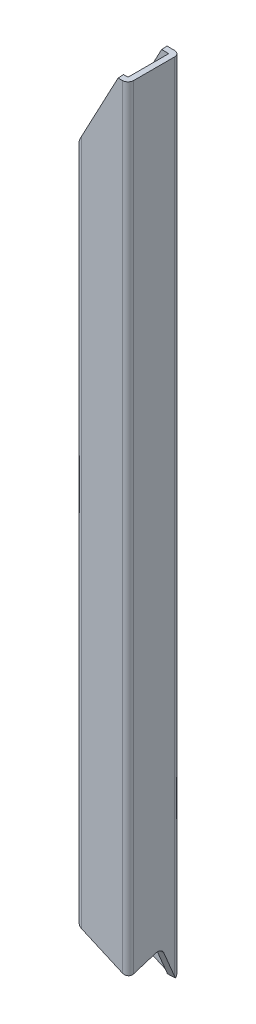
ISO-10303-21;
HEADER;
FILE_DESCRIPTION(('STEP AP214'),'2;1');
FILE_NAME('part.step','',(''),(''),'','','');
FILE_SCHEMA(('AUTOMOTIVE_DESIGN { 1 0 10303 214 1 1 1 1 }'));
ENDSEC;
DATA;
#1=APPLICATION_CONTEXT('core data for automotive mechanical design processes');
#2=APPLICATION_PROTOCOL_DEFINITION('international standard','automotive_design',2000,#1);
#3=PRODUCT_CONTEXT('',#1,'mechanical');
#4=PRODUCT('Part','Part','',(#3));
#5=PRODUCT_RELATED_PRODUCT_CATEGORY('part','',(#4));
#6=PRODUCT_DEFINITION_FORMATION('','',#4);
#7=PRODUCT_DEFINITION_CONTEXT('part definition',#1,'design');
#8=PRODUCT_DEFINITION('design','',#6,#7);
#9=PRODUCT_DEFINITION_SHAPE('','',#8);
#10=(LENGTH_UNIT() NAMED_UNIT(*) SI_UNIT(.MILLI.,.METRE.));
#11=(NAMED_UNIT(*) PLANE_ANGLE_UNIT() SI_UNIT($,.RADIAN.));
#12=(NAMED_UNIT(*) SI_UNIT($,.STERADIAN.) SOLID_ANGLE_UNIT());
#13=UNCERTAINTY_MEASURE_WITH_UNIT(LENGTH_MEASURE(1.E-05),#10,'distance_accuracy_value','');
#14=(GEOMETRIC_REPRESENTATION_CONTEXT(3) GLOBAL_UNCERTAINTY_ASSIGNED_CONTEXT((#13)) GLOBAL_UNIT_ASSIGNED_CONTEXT((#10,
#11,#12)) REPRESENTATION_CONTEXT('',''));
#15=CARTESIAN_POINT('',(0.,0.,0.));
#16=DIRECTION('',(0.,0.,1.));
#17=DIRECTION('',(1.,0.,0.));
#18=AXIS2_PLACEMENT_3D('',#15,#16,#17);
#19=CARTESIAN_POINT('',(0.,395.,2.80000000000002));
#20=DIRECTION('',(1.,0.,0.));
#21=DIRECTION('',(0.,0.,-1.));
#22=AXIS2_PLACEMENT_3D('',#19,#20,#21);
#23=PLANE('',#22);
#24=DIRECTION('',(0.,-1.,0.));
#25=VECTOR('',#24,1.);
#26=CARTESIAN_POINT('',(0.,395.,2.80000000000002));
#27=LINE('',#26,#25);
#28=CARTESIAN_POINT('',(0.,358.74045546164,2.80000000000002));
#29=VERTEX_POINT('',#28);
#30=CARTESIAN_POINT('',(0.,14.5870261023159,2.80000000000002));
#31=VERTEX_POINT('',#30);
#32=EDGE_CURVE('E213',#29,#31,#27,.T.);
#33=ORIENTED_EDGE('',*,*,#32,.T.);
#34=DIRECTION('',(0.,-0.298228213360965,0.954494595456426));
#35=VECTOR('',#34,1.);
#36=CARTESIAN_POINT('',(0.,48.4209815814461,-105.487298789719));
#37=LINE('',#36,#35);
#38=CARTESIAN_POINT('',(0.,11.7204381577487,11.974660806415));
#39=VERTEX_POINT('',#38);
#40=EDGE_CURVE('E211',#31,#39,#37,.T.);
#41=ORIENTED_EDGE('',*,*,#40,.T.);
#42=DIRECTION('',(0.,-0.922539490648256,-0.385902692649918));
#43=VECTOR('',#42,1.);
#44=CARTESIAN_POINT('',(0.,334.65539188562,147.059900471106));
#45=LINE('',#44,#43);
#46=CARTESIAN_POINT('',(0.,25.189594700071,17.6088735746435));
#47=VERTEX_POINT('',#46);
#48=EDGE_CURVE('E279',#47,#39,#45,.T.);
#49=ORIENTED_EDGE('',*,*,#48,.F.);
#50=CARTESIAN_POINT('',(0.,24.3305192274788,20.3583884057098));
#51=DIRECTION('',(1.,0.,0.));
#52=DIRECTION('',(0.,0.652023586451747,0.758198682873164));
#53=AXIS2_PLACEMENT_3D('',#50,#51,#52);
#54=ELLIPSE('',#53,3.12461688954562,2.8);
#55=CARTESIAN_POINT('',(0.,27.1447014447458,21.5355743216079));
#56=VERTEX_POINT('',#55);
#57=EDGE_CURVE('E219',#56,#47,#54,.F.);
#58=ORIENTED_EDGE('',*,*,#57,.F.);
#59=DIRECTION('',(0.,0.298228213360962,-0.954494595456427));
#60=VECTOR('',#59,1.);
#61=CARTESIAN_POINT('',(0.,65.1949928959895,-100.246322623854));
#62=LINE('',#61,#60);
#63=CARTESIAN_POINT('',(0.,26.7496364409316,22.8));
#64=VERTEX_POINT('',#63);
#65=EDGE_CURVE('E293',#64,#56,#62,.T.);
#66=ORIENTED_EDGE('',*,*,#65,.F.);
#67=DIRECTION('',(0.,-1.,0.));
#68=VECTOR('',#67,1.);
#69=CARTESIAN_POINT('',(0.,395.,22.8));
#70=LINE('',#69,#68);
#71=CARTESIAN_POINT('',(0.,356.354468869818,22.8));
#72=VERTEX_POINT('',#71);
#73=EDGE_CURVE('E236',#72,#64,#70,.T.);
#74=ORIENTED_EDGE('',*,*,#73,.F.);
#75=DIRECTION('',(0.,-0.118459331661431,0.992958904860784));
#76=VECTOR('',#75,1.);
#77=CARTESIAN_POINT('',(0.,359.249271627046,-1.46503792728784));
#78=LINE('',#77,#76);
#79=EDGE_CURVE('E280',#29,#72,#78,.T.);
#80=ORIENTED_EDGE('',*,*,#79,.F.);
#81=EDGE_LOOP('',(#33,#41,#49,#58,#66,#74,#80));
#82=FACE_BOUND('',#81,.T.);
#83=ADVANCED_FACE('F35',(#82),#23,.F.);
#84=CARTESIAN_POINT('',(2.8,395.,22.8));
#85=DIRECTION('',(0.,-1.,0.));
#86=DIRECTION('',(0.,0.,-1.));
#87=AXIS2_PLACEMENT_3D('',#84,#85,#86);
#88=CYLINDRICAL_SURFACE('',#87,2.8);
#89=CARTESIAN_POINT('',(2.8,25.5168770642586,22.8));
#90=DIRECTION('',(-0.387417802967793,-0.879952624037117,-0.274937857331073));
#91=DIRECTION('',(0.71761098211459,-0.475061448078238,0.509265253967263));
#92=AXIS2_PLACEMENT_3D('',#89,#90,#91);
#93=ELLIPSE('',#92,3.18198948842716,2.8);
#94=CARTESIAN_POINT('',(2.80000000000002,24.6420276922604,25.6));
#95=VERTEX_POINT('',#94);
#96=EDGE_CURVE('E297',#95,#64,#93,.T.);
#97=ORIENTED_EDGE('',*,*,#96,.F.);
#98=DIRECTION('',(0.,-1.,0.));
#99=VECTOR('',#98,1.);
#100=CARTESIAN_POINT('',(2.80000000000002,395.,25.6));
#101=LINE('',#100,#99);
#102=CARTESIAN_POINT('',(2.80000000000002,361.282665806789,25.6));
#103=VERTEX_POINT('',#102);
#104=EDGE_CURVE('E270',#103,#95,#101,.T.);
#105=ORIENTED_EDGE('',*,*,#104,.F.);
#106=CARTESIAN_POINT('',(2.8,361.616703929644,22.8));
#107=DIRECTION('',(-0.881424160088028,0.468999886965857,0.055951372093341));
#108=DIRECTION('',(-0.468057814635929,-0.883198225782872,0.0297115488021969));
#109=AXIS2_PLACEMENT_3D('',#106,#107,#108);
#110=ELLIPSE('',#109,5.97015069260313,2.8);
#111=EDGE_CURVE('E276',#72,#103,#110,.T.);
#112=ORIENTED_EDGE('',*,*,#111,.F.);
#113=ORIENTED_EDGE('',*,*,#73,.T.);
#114=EDGE_LOOP('',(#97,#105,#112,#113));
#115=FACE_BOUND('',#114,.T.);
#116=ADVANCED_FACE('F391',(#115),#88,.T.);
#117=CARTESIAN_POINT('',(2.80000000000002,395.,25.6));
#118=DIRECTION('',(0.,0.,-1.));
#119=DIRECTION('',(-1.,0.,0.));
#120=AXIS2_PLACEMENT_3D('',#117,#118,#119);
#121=PLANE('',#120);
#122=DIRECTION('',(-0.915223508976725,0.402946558015242,0.));
#123=VECTOR('',#122,1.);
#124=CARTESIAN_POINT('',(-133.782895453762,84.7755437864679,25.6));
#125=LINE('',#124,#123);
#126=CARTESIAN_POINT('',(22.8,15.8366035731672,25.6));
#127=VERTEX_POINT('',#126);
#128=EDGE_CURVE('E300',#127,#95,#125,.T.);
#129=ORIENTED_EDGE('',*,*,#128,.F.);
#130=DIRECTION('',(0.,-1.,0.));
#131=VECTOR('',#130,1.);
#132=CARTESIAN_POINT('',(22.8,395.,25.6));
#133=LINE('',#132,#131);
#134=CARTESIAN_POINT('',(22.8,395.,25.6));
#135=VERTEX_POINT('',#134);
#136=EDGE_CURVE('E240',#135,#127,#133,.T.);
#137=ORIENTED_EDGE('',*,*,#136,.F.);
#138=DIRECTION('',(1.,0.,0.));
#139=VECTOR('',#138,1.);
#140=CARTESIAN_POINT('',(2.80000000000002,395.,25.6));
#141=LINE('',#140,#139);
#142=CARTESIAN_POINT('',(20.7407675004355,395.,25.6));
#143=VERTEX_POINT('',#142);
#144=EDGE_CURVE('E246',#143,#135,#141,.T.);
#145=ORIENTED_EDGE('',*,*,#144,.F.);
#146=DIRECTION('',(-0.469735730330699,-0.882807081785531,0.));
#147=VECTOR('',#146,1.);
#148=CARTESIAN_POINT('',(16.7821074352865,387.560214362585,25.6));
#149=LINE('',#148,#147);
#150=EDGE_CURVE('E268',#143,#103,#149,.T.);
#151=ORIENTED_EDGE('',*,*,#150,.T.);
#152=ORIENTED_EDGE('',*,*,#104,.T.);
#153=EDGE_LOOP('',(#129,#137,#145,#151,#152));
#154=FACE_BOUND('',#153,.T.);
#155=ADVANCED_FACE('F387',(#154),#121,.F.);
#156=CARTESIAN_POINT('',(2.8,1040.5,2.8));
#157=DIRECTION('',(0.,0.,-1.));
#158=DIRECTION('',(-1.,0.,0.));
#159=AXIS2_PLACEMENT_3D('',#156,#157,#158);
#160=PLANE('',#159);
#161=DIRECTION('',(0.,-1.,0.));
#162=VECTOR('',#161,1.);
#163=CARTESIAN_POINT('',(2.8,1040.5,2.8));
#164=LINE('',#163,#162);
#165=CARTESIAN_POINT('',(2.8,364.002690521467,2.8));
#166=VERTEX_POINT('',#165);
#167=CARTESIAN_POINT('',(2.8,13.3542667256428,2.79999999999995));
#168=VERTEX_POINT('',#167);
#169=EDGE_CURVE('E262',#166,#168,#164,.T.);
#170=ORIENTED_EDGE('',*,*,#169,.T.);
#171=DIRECTION('',(0.915223508976725,-0.402946558015243,0.));
#172=VECTOR('',#171,1.);
#173=CARTESIAN_POINT('',(-375.997133566274,180.127737533036,2.79999999999994));
#174=LINE('',#173,#172);
#175=CARTESIAN_POINT('',(22.8,4.54884260654934,2.80000000000001));
#176=VERTEX_POINT('',#175);
#177=EDGE_CURVE('E56',#168,#176,#174,.T.);
#178=ORIENTED_EDGE('',*,*,#177,.T.);
#179=DIRECTION('',(0.,-1.,0.));
#180=VECTOR('',#179,1.);
#181=CARTESIAN_POINT('',(22.8,1040.5,2.8));
#182=LINE('',#181,#180);
#183=CARTESIAN_POINT('',(22.8,395.,2.8));
#184=VERTEX_POINT('',#183);
#185=EDGE_CURVE('E188',#184,#176,#182,.T.);
#186=ORIENTED_EDGE('',*,*,#185,.F.);
#187=DIRECTION('',(1.,0.,0.));
#188=VECTOR('',#187,1.);
#189=CARTESIAN_POINT('',(22.8,395.,2.8));
#190=LINE('',#189,#188);
#191=CARTESIAN_POINT('',(19.2934605834108,395.,2.8));
#192=VERTEX_POINT('',#191);
#193=EDGE_CURVE('E251',#192,#184,#190,.T.);
#194=ORIENTED_EDGE('',*,*,#193,.F.);
#195=DIRECTION('',(-0.469735730330699,-0.88280708178553,0.));
#196=VECTOR('',#195,1.);
#197=CARTESIAN_POINT('',(283.333983102248,891.229748147706,2.80000000000004));
#198=LINE('',#197,#196);
#199=EDGE_CURVE('E264',#192,#166,#198,.T.);
#200=ORIENTED_EDGE('',*,*,#199,.T.);
#201=EDGE_LOOP('',(#170,#178,#186,#194,#200));
#202=FACE_BOUND('',#201,.T.);
#203=ADVANCED_FACE('F337',(#202),#160,.F.);
#204=CARTESIAN_POINT('',(2.8,1040.5,2.8));
#205=DIRECTION('',(-1.,0.,0.));
#206=DIRECTION('',(0.,0.,1.));
#207=AXIS2_PLACEMENT_3D('',#204,#205,#206);
#208=PLANE('',#207);
#209=DIRECTION('',(0.,0.922539490648256,0.385902692649918));
#210=VECTOR('',#209,1.);
#211=CARTESIAN_POINT('',(2.79999999999988,884.266635705854,376.291688613163));
#212=LINE('',#211,#210);
#213=CARTESIAN_POINT('',(2.7999999999999,10.8162079771028,10.9231863717081));
#214=VERTEX_POINT('',#213);
#215=CARTESIAN_POINT('',(2.80000000000007,24.2853645194249,16.5573991399364));
#216=VERTEX_POINT('',#215);
#217=EDGE_CURVE('E309',#214,#216,#212,.T.);
#218=ORIENTED_EDGE('',*,*,#217,.F.);
#219=DIRECTION('',(0.,0.298228213360965,-0.954494595456426));
#220=VECTOR('',#219,1.);
#221=CARTESIAN_POINT('',(2.8000000000001,104.708677312938,-289.584446776469));
#222=LINE('',#221,#220);
#223=EDGE_CURVE('E49',#214,#168,#222,.T.);
#224=ORIENTED_EDGE('',*,*,#223,.T.);
#225=ORIENTED_EDGE('',*,*,#169,.F.);
#226=DIRECTION('',(0.,0.118459331661432,-0.992958904860784));
#227=VECTOR('',#226,1.);
#228=CARTESIAN_POINT('',(2.80000000000003,373.495715635236,-76.7731639591262));
#229=LINE('',#228,#227);
#230=CARTESIAN_POINT('',(2.79999999999995,361.616703929644,22.8));
#231=VERTEX_POINT('',#230);
#232=EDGE_CURVE('E261',#231,#166,#229,.T.);
#233=ORIENTED_EDGE('',*,*,#232,.F.);
#234=DIRECTION('',(0.,-1.,0.));
#235=VECTOR('',#234,1.);
#236=CARTESIAN_POINT('',(2.8,1040.5,22.8));
#237=LINE('',#236,#235);
#238=CARTESIAN_POINT('',(2.79999999999991,25.5168770642586,22.8));
#239=VERTEX_POINT('',#238);
#240=EDGE_CURVE('E226',#231,#239,#237,.T.);
#241=ORIENTED_EDGE('',*,*,#240,.T.);
#242=DIRECTION('',(0.,-0.298228213360962,0.954494595456427));
#243=VECTOR('',#242,1.);
#244=CARTESIAN_POINT('',(2.8000000000001,121.48268862748,-284.343470610602));
#245=LINE('',#244,#243);
#246=CARTESIAN_POINT('',(2.79999999999998,26.2404712640998,20.4840998869009));
#247=VERTEX_POINT('',#246);
#248=EDGE_CURVE('E295',#247,#239,#245,.T.);
#249=ORIENTED_EDGE('',*,*,#248,.F.);
#250=CARTESIAN_POINT('',(2.8,23.4262890468328,19.3069139710028));
#251=DIRECTION('',(-1.,0.,0.));
#252=DIRECTION('',(0.,0.652023586451747,0.758198682873165));
#253=AXIS2_PLACEMENT_3D('',#250,#251,#252);
#254=ELLIPSE('',#253,3.12461688954562,2.8);
#255=EDGE_CURVE('E289',#216,#247,#254,.F.);
#256=ORIENTED_EDGE('',*,*,#255,.F.);
#257=EDGE_LOOP('',(#218,#224,#225,#233,#241,#249,#256));
#258=FACE_BOUND('',#257,.T.);
#259=ADVANCED_FACE('F340',(#258),#208,.F.);
#260=CARTESIAN_POINT('',(2.8,1040.5,22.8));
#261=DIRECTION('',(0.,0.,1.));
#262=DIRECTION('',(1.,0.,0.));
#263=AXIS2_PLACEMENT_3D('',#260,#261,#262);
#264=PLANE('',#263);
#265=DIRECTION('',(0.915223508976725,-0.402946558015242,0.));
#266=VECTOR('',#265,1.);
#267=CARTESIAN_POINT('',(-371.511731170389,190.315554349624,22.7999999999999));
#268=LINE('',#267,#266);
#269=CARTESIAN_POINT('',(22.8,16.7114529451654,22.8));
#270=VERTEX_POINT('',#269);
#271=EDGE_CURVE('E217',#239,#270,#268,.T.);
#272=ORIENTED_EDGE('',*,*,#271,.F.);
#273=ORIENTED_EDGE('',*,*,#240,.F.);
#274=DIRECTION('',(0.469735730330699,0.88280708178553,0.));
#275=VECTOR('',#274,1.);
#276=CARTESIAN_POINT('',(284.323418407983,890.703276254193,22.8));
#277=LINE('',#276,#275);
#278=CARTESIAN_POINT('',(20.5630280544853,395.,22.8));
#279=VERTEX_POINT('',#278);
#280=EDGE_CURVE('E222',#231,#279,#277,.T.);
#281=ORIENTED_EDGE('',*,*,#280,.T.);
#282=DIRECTION('',(-1.,0.,0.));
#283=VECTOR('',#282,1.);
#284=CARTESIAN_POINT('',(22.8,395.,22.8));
#285=LINE('',#284,#283);
#286=CARTESIAN_POINT('',(22.8,395.,22.8));
#287=VERTEX_POINT('',#286);
#288=EDGE_CURVE('E257',#287,#279,#285,.T.);
#289=ORIENTED_EDGE('',*,*,#288,.F.);
#290=DIRECTION('',(0.,-1.,0.));
#291=VECTOR('',#290,1.);
#292=CARTESIAN_POINT('',(22.8,1040.5,22.8));
#293=LINE('',#292,#291);
#294=EDGE_CURVE('E225',#287,#270,#293,.T.);
#295=ORIENTED_EDGE('',*,*,#294,.T.);
#296=EDGE_LOOP('',(#272,#273,#281,#289,#295));
#297=FACE_BOUND('',#296,.T.);
#298=ADVANCED_FACE('F330',(#297),#264,.F.);
#299=CARTESIAN_POINT('',(22.8,395.,2.8));
#300=DIRECTION('',(0.,-1.,0.));
#301=DIRECTION('',(0.,0.,-1.));
#302=AXIS2_PLACEMENT_3D('',#299,#300,#301);
#303=CYLINDRICAL_SURFACE('',#302,2.8);
#304=CARTESIAN_POINT('',(22.8,2.89280784268892,2.8));
#305=DIRECTION('',(0.216551533658863,-0.376745680354175,0.90064872486695));
#306=DIRECTION('',(-0.0880744694064176,-0.926316734348716,-0.366306149967904));
#307=AXIS2_PLACEMENT_3D('',#304,#305,#306);
#308=ELLIPSE('',#307,7.43206928707914,2.8);
#309=CARTESIAN_POINT('',(25.5673195254718,3.4637446030511,2.37345264747928));
#310=VERTEX_POINT('',#309);
#311=CARTESIAN_POINT('',(25.6,4.50223384506493,2.80000000000002));
#312=VERTEX_POINT('',#311);
#313=EDGE_CURVE('E182',#310,#312,#308,.T.);
#314=ORIENTED_EDGE('',*,*,#313,.F.);
#315=CARTESIAN_POINT('',(22.8,4.54884260654959,2.8));
#316=DIRECTION('',(0.387417802967793,0.879952624037115,0.274937857331076));
#317=DIRECTION('',(0.717610982114586,-0.47506144807824,0.509265253967267));
#318=AXIS2_PLACEMENT_3D('',#315,#316,#317);
#319=ELLIPSE('',#318,3.18198948842716,2.8);
#320=CARTESIAN_POINT('',(22.8,5.42369197854776,0.));
#321=VERTEX_POINT('',#320);
#322=EDGE_CURVE('E190',#310,#321,#319,.T.);
#323=ORIENTED_EDGE('',*,*,#322,.T.);
#324=DIRECTION('',(0.,-1.,0.));
#325=VECTOR('',#324,1.);
#326=CARTESIAN_POINT('',(22.8,395.,0.));
#327=LINE('',#326,#325);
#328=CARTESIAN_POINT('',(22.8,395.,0.));
#329=VERTEX_POINT('',#328);
#330=EDGE_CURVE('E227',#329,#321,#327,.T.);
#331=ORIENTED_EDGE('',*,*,#330,.F.);
#332=CARTESIAN_POINT('',(22.8,395.,2.8));
#333=DIRECTION('',(0.,1.,0.));
#334=DIRECTION('',(0.,0.,-1.));
#335=AXIS2_PLACEMENT_3D('',#332,#333,#334);
#336=CIRCLE('',#335,2.8);
#337=CARTESIAN_POINT('',(25.6,395.,2.80000000000002));
#338=VERTEX_POINT('',#337);
#339=EDGE_CURVE('E243',#338,#329,#336,.T.);
#340=ORIENTED_EDGE('',*,*,#339,.F.);
#341=DIRECTION('',(0.,-1.,0.));
#342=VECTOR('',#341,1.);
#343=CARTESIAN_POINT('',(25.6,395.,2.80000000000002));
#344=LINE('',#343,#342);
#345=EDGE_CURVE('E237',#338,#312,#344,.T.);
#346=ORIENTED_EDGE('',*,*,#345,.T.);
#347=EDGE_LOOP('',(#314,#323,#331,#340,#346));
#348=FACE_BOUND('',#347,.T.);
#349=ADVANCED_FACE('F366',(#348),#303,.T.);
#350=CARTESIAN_POINT('',(22.8,395.,22.8));
#351=DIRECTION('',(0.,-1.,0.));
#352=DIRECTION('',(0.,0.,-1.));
#353=AXIS2_PLACEMENT_3D('',#350,#351,#352);
#354=CYLINDRICAL_SURFACE('',#353,2.8);
#355=CARTESIAN_POINT('',(22.8,16.7114529451654,22.8));
#356=DIRECTION('',(-0.387417802967793,-0.879952624037117,-0.274937857331073));
#357=DIRECTION('',(0.71761098211459,-0.475061448078238,0.509265253967263));
#358=AXIS2_PLACEMENT_3D('',#355,#356,#357);
#359=ELLIPSE('',#358,3.18198948842716,2.8);
#360=CARTESIAN_POINT('',(25.6,15.4786935684922,22.8));
#361=VERTEX_POINT('',#360);
#362=EDGE_CURVE('E302',#361,#127,#359,.T.);
#363=ORIENTED_EDGE('',*,*,#362,.F.);
#364=DIRECTION('',(0.,-1.,0.));
#365=VECTOR('',#364,1.);
#366=CARTESIAN_POINT('',(25.6,395.,22.8));
#367=LINE('',#366,#365);
#368=CARTESIAN_POINT('',(25.6,395.,22.8));
#369=VERTEX_POINT('',#368);
#370=EDGE_CURVE('E266',#369,#361,#367,.T.);
#371=ORIENTED_EDGE('',*,*,#370,.F.);
#372=CARTESIAN_POINT('',(22.8,395.,22.8));
#373=DIRECTION('',(0.,1.,0.));
#374=DIRECTION('',(0.,0.,1.));
#375=AXIS2_PLACEMENT_3D('',#372,#373,#374);
#376=CIRCLE('',#375,2.8);
#377=EDGE_CURVE('E244',#135,#369,#376,.T.);
#378=ORIENTED_EDGE('',*,*,#377,.F.);
#379=ORIENTED_EDGE('',*,*,#136,.T.);
#380=EDGE_LOOP('',(#363,#371,#378,#379));
#381=FACE_BOUND('',#380,.T.);
#382=ADVANCED_FACE('F382',(#381),#354,.T.);
#383=CARTESIAN_POINT('',(25.6,395.,2.80000000000002));
#384=DIRECTION('',(-1.,0.,0.));
#385=DIRECTION('',(0.,0.,1.));
#386=AXIS2_PLACEMENT_3D('',#383,#384,#385);
#387=PLANE('',#386);
#388=DIRECTION('',(0.,-0.298228213360962,0.954494595456427));
#389=VECTOR('',#388,1.);
#390=CARTESIAN_POINT('',(25.6,54.9264884405334,-103.454677864646));
#391=LINE('',#390,#389);
#392=CARTESIAN_POINT('',(25.6,18.8774540788389,11.9220937757149));
#393=VERTEX_POINT('',#392);
#394=EDGE_CURVE('E216',#393,#361,#391,.T.);
#395=ORIENTED_EDGE('',*,*,#394,.F.);
#396=CARTESIAN_POINT('',(25.6,16.0632718615719,10.7449078598169));
#397=DIRECTION('',(-1.,0.,0.));
#398=DIRECTION('',(0.,0.652023586451747,0.758198682873164));
#399=AXIS2_PLACEMENT_3D('',#396,#397,#398);
#400=ELLIPSE('',#399,3.12461688954562,2.8);
#401=CARTESIAN_POINT('',(25.6,16.9223473341641,7.9953930287505));
#402=VERTEX_POINT('',#401);
#403=EDGE_CURVE('E291',#402,#393,#400,.F.);
#404=ORIENTED_EDGE('',*,*,#403,.F.);
#405=DIRECTION('',(0.,0.922539490648256,0.385902692649918));
#406=VECTOR('',#405,1.);
#407=CARTESIAN_POINT('',(25.6,336.846725826256,141.821294636167));
#408=LINE('',#407,#406);
#409=EDGE_CURVE('E299',#312,#402,#408,.T.);
#410=ORIENTED_EDGE('',*,*,#409,.F.);
#411=ORIENTED_EDGE('',*,*,#345,.F.);
#412=DIRECTION('',(0.,0.,-1.));
#413=VECTOR('',#412,1.);
#414=CARTESIAN_POINT('',(25.6,395.,2.80000000000002));
#415=LINE('',#414,#413);
#416=EDGE_CURVE('E241',#369,#338,#415,.T.);
#417=ORIENTED_EDGE('',*,*,#416,.F.);
#418=ORIENTED_EDGE('',*,*,#370,.T.);
#419=EDGE_LOOP('',(#395,#404,#410,#411,#417,#418));
#420=FACE_BOUND('',#419,.T.);
#421=ADVANCED_FACE('F374',(#420),#387,.F.);
#422=CARTESIAN_POINT('',(22.8,1040.5,2.8));
#423=DIRECTION('',(1.,0.,0.));
#424=DIRECTION('',(0.,0.,-1.));
#425=AXIS2_PLACEMENT_3D('',#422,#423,#424);
#426=PLANE('',#425);
#427=ORIENTED_EDGE('',*,*,#185,.T.);
#428=DIRECTION('',(0.,-0.298228213360965,0.954494595456426));
#429=VECTOR('',#428,1.);
#430=CARTESIAN_POINT('',(22.8000000000001,96.6864082071128,-292.090974308338));
#431=LINE('',#430,#429);
#432=CARTESIAN_POINT('',(22.7999999999999,4.35742097248806,3.41265469522915));
#433=VERTEX_POINT('',#432);
#434=EDGE_CURVE('E185',#176,#433,#431,.T.);
#435=ORIENTED_EDGE('',*,*,#434,.T.);
#436=DIRECTION('',(0.,-0.922539490648256,-0.385902692649918));
#437=VECTOR('',#436,1.);
#438=CARTESIAN_POINT('',(22.7999999999999,885.978615346976,372.199027804617));
#439=LINE('',#438,#437);
#440=CARTESIAN_POINT('',(22.8,17.8265775148101,9.04686746345754));
#441=VERTEX_POINT('',#440);
#442=EDGE_CURVE('E173',#441,#433,#439,.T.);
#443=ORIENTED_EDGE('',*,*,#442,.F.);
#444=CARTESIAN_POINT('',(22.8,16.967502042218,11.7963822945239));
#445=DIRECTION('',(1.,0.,0.));
#446=DIRECTION('',(0.,0.652023586451747,0.758198682873165));
#447=AXIS2_PLACEMENT_3D('',#444,#445,#446);
#448=ELLIPSE('',#447,3.12461688954562,2.8);
#449=CARTESIAN_POINT('',(22.8,19.7816842594851,12.9735682104219));
#450=VERTEX_POINT('',#449);
#451=EDGE_CURVE('E218',#450,#441,#448,.F.);
#452=ORIENTED_EDGE('',*,*,#451,.F.);
#453=DIRECTION('',(0.,0.298228213360962,-0.954494595456427));
#454=VECTOR('',#453,1.);
#455=CARTESIAN_POINT('',(22.8000000000001,113.460419521655,-286.84999814247));
#456=LINE('',#455,#454);
#457=EDGE_CURVE('E214',#270,#450,#456,.T.);
#458=ORIENTED_EDGE('',*,*,#457,.F.);
#459=ORIENTED_EDGE('',*,*,#294,.F.);
#460=DIRECTION('',(0.,0.,1.));
#461=VECTOR('',#460,1.);
#462=CARTESIAN_POINT('',(22.8,395.,2.8));
#463=LINE('',#462,#461);
#464=EDGE_CURVE('E254',#184,#287,#463,.T.);
#465=ORIENTED_EDGE('',*,*,#464,.F.);
#466=EDGE_LOOP('',(#427,#435,#443,#452,#458,#459,#465));
#467=FACE_BOUND('',#466,.T.);
#468=ADVANCED_FACE('F186',(#467),#426,.F.);
#469=CARTESIAN_POINT('',(2.80000000000002,395.,0.));
#470=DIRECTION('',(0.,0.,1.));
#471=DIRECTION('',(1.,0.,0.));
#472=AXIS2_PLACEMENT_3D('',#469,#470,#471);
#473=PLANE('',#472);
#474=ORIENTED_EDGE('',*,*,#330,.T.);
#475=DIRECTION('',(-0.915223508976725,0.402946558015243,0.));
#476=VECTOR('',#475,1.);
#477=CARTESIAN_POINT('',(-137.623033163867,76.0533342525088,0.));
#478=LINE('',#477,#476);
#479=CARTESIAN_POINT('',(2.80000000000002,14.229116097641,0.));
#480=VERTEX_POINT('',#479);
#481=EDGE_CURVE('E197',#321,#480,#478,.T.);
#482=ORIENTED_EDGE('',*,*,#481,.T.);
#483=DIRECTION('',(0.,-1.,0.));
#484=VECTOR('',#483,1.);
#485=CARTESIAN_POINT('',(2.80000000000002,395.,0.));
#486=LINE('',#485,#484);
#487=CARTESIAN_POINT('',(2.80000000000002,364.336728644322,0.));
#488=VERTEX_POINT('',#487);
#489=EDGE_CURVE('E229',#488,#480,#486,.T.);
#490=ORIENTED_EDGE('',*,*,#489,.F.);
#491=DIRECTION('',(0.469735730330699,0.882807081785531,0.));
#492=VECTOR('',#491,1.);
#493=CARTESIAN_POINT('',(15.5156302439462,388.234098386281,0.));
#494=LINE('',#493,#492);
#495=CARTESIAN_POINT('',(19.1157211374603,395.,0.));
#496=VERTEX_POINT('',#495);
#497=EDGE_CURVE('E230',#488,#496,#494,.T.);
#498=ORIENTED_EDGE('',*,*,#497,.T.);
#499=DIRECTION('',(-1.,0.,0.));
#500=VECTOR('',#499,1.);
#501=CARTESIAN_POINT('',(2.80000000000002,395.,0.));
#502=LINE('',#501,#500);
#503=EDGE_CURVE('E248',#329,#496,#502,.T.);
#504=ORIENTED_EDGE('',*,*,#503,.F.);
#505=EDGE_LOOP('',(#474,#482,#490,#498,#504));
#506=FACE_BOUND('',#505,.T.);
#507=ADVANCED_FACE('F364',(#506),#473,.F.);
#508=CARTESIAN_POINT('',(2.8,395.,2.8));
#509=DIRECTION('',(0.,-1.,0.));
#510=DIRECTION('',(0.,0.,-1.));
#511=AXIS2_PLACEMENT_3D('',#508,#509,#510);
#512=CYLINDRICAL_SURFACE('',#511,2.8);
#513=ORIENTED_EDGE('',*,*,#489,.T.);
#514=CARTESIAN_POINT('',(2.8,13.3542667256429,2.8));
#515=DIRECTION('',(0.387417802967793,0.879952624037115,0.274937857331076));
#516=DIRECTION('',(0.717610982114586,-0.47506144807824,0.509265253967267));
#517=AXIS2_PLACEMENT_3D('',#514,#515,#516);
#518=ELLIPSE('',#517,3.18198948842716,2.8);
#519=EDGE_CURVE('E209',#480,#31,#518,.T.);
#520=ORIENTED_EDGE('',*,*,#519,.T.);
#521=ORIENTED_EDGE('',*,*,#32,.F.);
#522=CARTESIAN_POINT('',(2.8,364.002690521467,2.8));
#523=DIRECTION('',(-0.881424160088028,0.468999886965857,0.055951372093341));
#524=DIRECTION('',(-0.468057814635929,-0.883198225782872,0.0297115488021969));
#525=AXIS2_PLACEMENT_3D('',#522,#523,#524);
#526=ELLIPSE('',#525,5.97015069260313,2.8);
#527=EDGE_CURVE('E283',#488,#29,#526,.T.);
#528=ORIENTED_EDGE('',*,*,#527,.F.);
#529=EDGE_LOOP('',(#513,#520,#521,#528));
#530=FACE_BOUND('',#529,.T.);
#531=ADVANCED_FACE('F360',(#530),#512,.T.);
#532=CARTESIAN_POINT('',(22.8,395.,2.8));
#533=DIRECTION('',(0.,-1.,0.));
#534=DIRECTION('',(0.,0.,-1.));
#535=AXIS2_PLACEMENT_3D('',#532,#533,#534);
#536=PLANE('',#535);
#537=DIRECTION('',(0.06335086559277,0.,0.997991316509641));
#538=VECTOR('',#537,1.);
#539=CARTESIAN_POINT('',(19.3075334908615,395.,3.02169609369096));
#540=LINE('',#539,#538);
#541=EDGE_CURVE('E233',#279,#143,#540,.T.);
#542=ORIENTED_EDGE('',*,*,#541,.T.);
#543=ORIENTED_EDGE('',*,*,#144,.T.);
#544=ORIENTED_EDGE('',*,*,#377,.T.);
#545=ORIENTED_EDGE('',*,*,#416,.T.);
#546=ORIENTED_EDGE('',*,*,#339,.T.);
#547=ORIENTED_EDGE('',*,*,#503,.T.);
#548=DIRECTION('',(-0.063350865592767,0.,-0.997991316509641));
#549=VECTOR('',#548,1.);
#550=CARTESIAN_POINT('',(19.3075334908614,395.,3.02169609369095));
#551=LINE('',#550,#549);
#552=EDGE_CURVE('E275',#192,#496,#551,.T.);
#553=ORIENTED_EDGE('',*,*,#552,.F.);
#554=ORIENTED_EDGE('',*,*,#193,.T.);
#555=ORIENTED_EDGE('',*,*,#464,.T.);
#556=ORIENTED_EDGE('',*,*,#288,.T.);
#557=EDGE_LOOP('',(#542,#543,#544,#545,#546,#547,#553,#554,#555,#556));
#558=FACE_BOUND('',#557,.T.);
#559=ADVANCED_FACE('F334',(#558),#536,.F.);
#560=CARTESIAN_POINT('',(-20.916702297544,339.965130763059,-169.329140586136));
#561=DIRECTION('',(0.881424160088027,-0.468999886965858,-0.0559513720933436));
#562=DIRECTION('',(0.448001363104984,0.867670060947867,-0.215507410524098));
#563=AXIS2_PLACEMENT_3D('',#560,#561,#562);
#564=PLANE('',#563);
#565=ORIENTED_EDGE('',*,*,#232,.T.);
#566=ORIENTED_EDGE('',*,*,#199,.F.);
#567=ORIENTED_EDGE('',*,*,#552,.T.);
#568=ORIENTED_EDGE('',*,*,#497,.F.);
#569=ORIENTED_EDGE('',*,*,#527,.T.);
#570=ORIENTED_EDGE('',*,*,#79,.T.);
#571=ORIENTED_EDGE('',*,*,#111,.T.);
#572=ORIENTED_EDGE('',*,*,#150,.F.);
#573=ORIENTED_EDGE('',*,*,#541,.F.);
#574=ORIENTED_EDGE('',*,*,#280,.F.);
#575=EDGE_LOOP('',(#565,#566,#567,#568,#569,#570,#571,#572,#573,#574));
#576=FACE_BOUND('',#575,.T.);
#577=ADVANCED_FACE('F341',(#576),#564,.F.);
#578=CARTESIAN_POINT('',(58.3344566698673,-13.7501983848662,-12.7057364856606));
#579=DIRECTION('',(0.216551533658863,-0.376745680354175,0.90064872486695));
#580=DIRECTION('',(-0.387417802967793,-0.879952624037117,-0.274937857331073));
#581=AXIS2_PLACEMENT_3D('',#578,#579,#580);
#582=PLANE('',#581);
#583=DIRECTION('',(-0.896109858897671,0.289389135567772,0.3365130740428));
#584=VECTOR('',#583,1.);
#585=CARTESIAN_POINT('',(60.8909190381793,-7.94363567139345,-10.8914980058929));
#586=LINE('',#585,#584);
#587=EDGE_CURVE('E206',#214,#39,#586,.T.);
#588=ORIENTED_EDGE('',*,*,#587,.F.);
#589=ORIENTED_EDGE('',*,*,#217,.T.);
#590=DIRECTION('',(-0.896109858897671,0.289389135567772,0.3365130740428));
#591=VECTOR('',#590,1.);
#592=CARTESIAN_POINT('',(66.0828127292231,3.84885409587613,-7.20697933903917));
#593=LINE('',#592,#591);
#594=EDGE_CURVE('E296',#216,#47,#593,.T.);
#595=ORIENTED_EDGE('',*,*,#594,.T.);
#596=ORIENTED_EDGE('',*,*,#48,.T.);
#597=EDGE_LOOP('',(#588,#589,#595,#596));
#598=FACE_BOUND('',#597,.T.);
#599=ADVANCED_FACE('F357',(#598),#582,.T.);
#600=CARTESIAN_POINT('',(67.7739268717777,5.25783353818837,-3.91533690888468));
#601=DIRECTION('',(-0.387417802967793,-0.879952624037117,-0.274937857331073));
#602=DIRECTION('',(-0.216551533658863,0.376745680354175,-0.90064872486695));
#603=AXIS2_PLACEMENT_3D('',#600,#601,#602);
#604=PLANE('',#603);
#605=ORIENTED_EDGE('',*,*,#65,.T.);
#606=DIRECTION('',(-0.896109858897671,0.289389135567772,0.3365130740428));
#607=VECTOR('',#606,1.);
#608=CARTESIAN_POINT('',(67.7739268717777,5.25783353818837,-3.91533690888468));
#609=LINE('',#608,#607);
#610=EDGE_CURVE('E42',#247,#56,#609,.T.);
#611=ORIENTED_EDGE('',*,*,#610,.F.);
#612=ORIENTED_EDGE('',*,*,#248,.T.);
#613=ORIENTED_EDGE('',*,*,#271,.T.);
#614=ORIENTED_EDGE('',*,*,#457,.T.);
#615=EDGE_CURVE('E220',#393,#450,#609,.T.);
#616=ORIENTED_EDGE('',*,*,#615,.F.);
#617=ORIENTED_EDGE('',*,*,#394,.T.);
#618=ORIENTED_EDGE('',*,*,#362,.T.);
#619=ORIENTED_EDGE('',*,*,#128,.T.);
#620=ORIENTED_EDGE('',*,*,#96,.T.);
#621=EDGE_LOOP('',(#605,#611,#612,#613,#614,#616,#617,#618,#619,#620));
#622=FACE_BOUND('',#621,.T.);
#623=ADVANCED_FACE('F347',(#622),#604,.T.);
#624=DIRECTION('',(-0.896109858897671,0.289389135567772,0.3365130740428));
#625=VECTOR('',#624,1.);
#626=CARTESIAN_POINT('',(60.8909190381793,-7.94363567139345,-10.8914980058929));
#627=LINE('',#626,#625);
#628=EDGE_CURVE('E12',#310,#433,#627,.T.);
#629=ORIENTED_EDGE('',*,*,#628,.F.);
#630=ORIENTED_EDGE('',*,*,#313,.T.);
#631=ORIENTED_EDGE('',*,*,#409,.T.);
#632=EDGE_CURVE('E178',#402,#441,#593,.T.);
#633=ORIENTED_EDGE('',*,*,#632,.T.);
#634=ORIENTED_EDGE('',*,*,#442,.T.);
#635=EDGE_LOOP('',(#629,#630,#631,#633,#634));
#636=FACE_BOUND('',#635,.T.);
#637=ADVANCED_FACE('F175',(#636),#582,.T.);
#638=CARTESIAN_POINT('',(66.6891570234679,2.79396619088446,-4.68516290941171));
#639=DIRECTION('',(-0.896109858897671,0.289389135567772,0.3365130740428));
#640=DIRECTION('',(-0.387417802967793,-0.879952624037117,-0.274937857331073));
#641=AXIS2_PLACEMENT_3D('',#638,#639,#640);
#642=CYLINDRICAL_SURFACE('',#641,2.8);
#643=ORIENTED_EDGE('',*,*,#403,.T.);
#644=ORIENTED_EDGE('',*,*,#615,.T.);
#645=ORIENTED_EDGE('',*,*,#451,.T.);
#646=ORIENTED_EDGE('',*,*,#632,.F.);
#647=EDGE_LOOP('',(#643,#644,#645,#646));
#648=FACE_BOUND('',#647,.T.);
#649=ADVANCED_FACE('F377',(#648),#642,.F.);
#650=ORIENTED_EDGE('',*,*,#57,.T.);
#651=ORIENTED_EDGE('',*,*,#594,.F.);
#652=ORIENTED_EDGE('',*,*,#255,.T.);
#653=ORIENTED_EDGE('',*,*,#610,.T.);
#654=EDGE_LOOP('',(#650,#651,#652,#653));
#655=FACE_BOUND('',#654,.T.);
#656=ADVANCED_FACE('F351',(#655),#642,.F.);
#657=CARTESIAN_POINT('',(5.27109733512903,11.9723871646328,3.7407269258207));
#658=DIRECTION('',(0.387417802967793,0.879952624037115,0.274937857331076));
#659=DIRECTION('',(-0.915223508976725,0.402946558015243,0.));
#660=AXIS2_PLACEMENT_3D('',#657,#658,#659);
#661=PLANE('',#660);
#662=ORIENTED_EDGE('',*,*,#40,.F.);
#663=ORIENTED_EDGE('',*,*,#519,.F.);
#664=ORIENTED_EDGE('',*,*,#481,.F.);
#665=ORIENTED_EDGE('',*,*,#322,.F.);
#666=ORIENTED_EDGE('',*,*,#628,.T.);
#667=ORIENTED_EDGE('',*,*,#434,.F.);
#668=ORIENTED_EDGE('',*,*,#177,.F.);
#669=ORIENTED_EDGE('',*,*,#223,.F.);
#670=ORIENTED_EDGE('',*,*,#587,.T.);
#671=EDGE_LOOP('',(#662,#663,#664,#665,#666,#667,#668,#669,#670));
#672=FACE_BOUND('',#671,.T.);
#673=ADVANCED_FACE('F194',(#672),#661,.F.);
#674=CLOSED_SHELL('',(#83,#116,#155,#203,#259,#298,#349,#382,#421,#468,#507,#531,#559,#577,#599,
#623,#637,#649,#656,#673));
#675=MANIFOLD_SOLID_BREP('B2',#674);
#676=ADVANCED_BREP_SHAPE_REPRESENTATION('',(#18,#675),#14);
#677=SHAPE_DEFINITION_REPRESENTATION(#9,#676);
ENDSEC;
END-ISO-10303-21;
